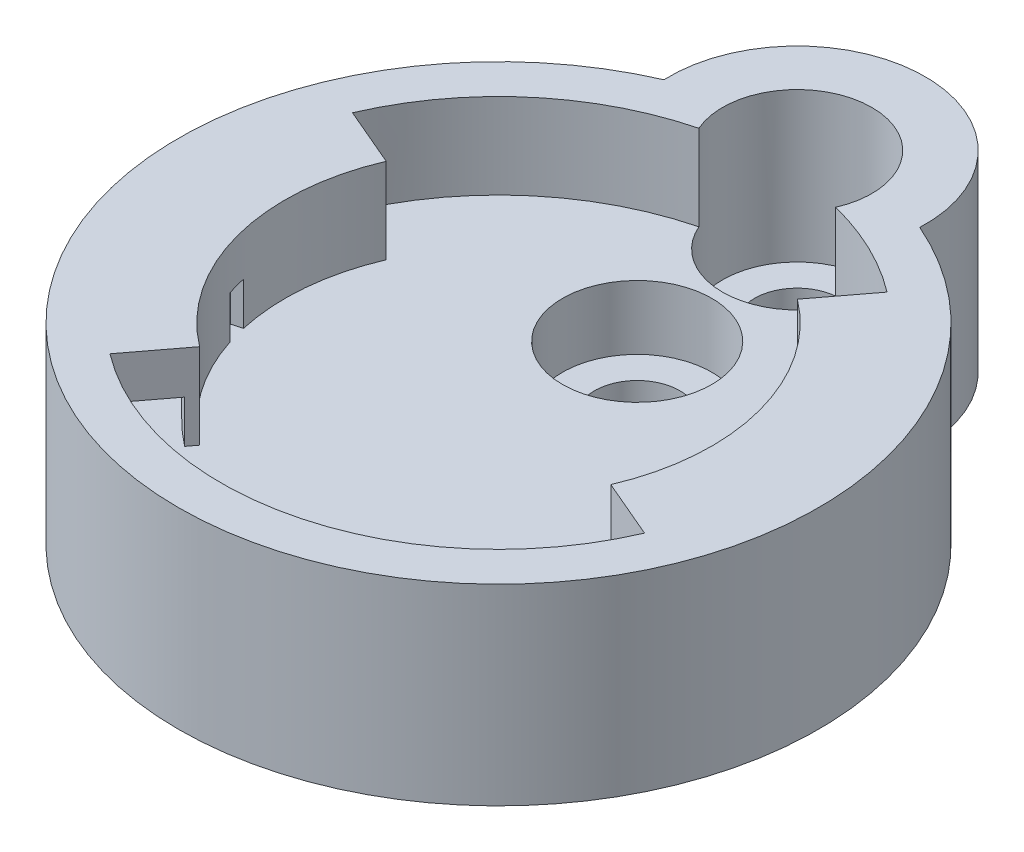
ISO-10303-21;
HEADER;
FILE_DESCRIPTION(('STEP AP214'),'2;1');
FILE_NAME('part.step','',(''),(''),'','','');
FILE_SCHEMA(('AUTOMOTIVE_DESIGN { 1 0 10303 214 1 1 1 1 }'));
ENDSEC;
DATA;
#1=APPLICATION_CONTEXT('core data for automotive mechanical design processes');
#2=APPLICATION_PROTOCOL_DEFINITION('international standard','automotive_design',2000,#1);
#3=PRODUCT_CONTEXT('',#1,'mechanical');
#4=PRODUCT('Part','Part','',(#3));
#5=PRODUCT_RELATED_PRODUCT_CATEGORY('part','',(#4));
#6=PRODUCT_DEFINITION_FORMATION('','',#4);
#7=PRODUCT_DEFINITION_CONTEXT('part definition',#1,'design');
#8=PRODUCT_DEFINITION('design','',#6,#7);
#9=PRODUCT_DEFINITION_SHAPE('','',#8);
#10=(LENGTH_UNIT() NAMED_UNIT(*) SI_UNIT(.MILLI.,.METRE.));
#11=(NAMED_UNIT(*) PLANE_ANGLE_UNIT() SI_UNIT($,.RADIAN.));
#12=(NAMED_UNIT(*) SI_UNIT($,.STERADIAN.) SOLID_ANGLE_UNIT());
#13=UNCERTAINTY_MEASURE_WITH_UNIT(LENGTH_MEASURE(1.E-05),#10,'distance_accuracy_value','');
#14=(GEOMETRIC_REPRESENTATION_CONTEXT(3) GLOBAL_UNCERTAINTY_ASSIGNED_CONTEXT((#13)) GLOBAL_UNIT_ASSIGNED_CONTEXT((#10,
#11,#12)) REPRESENTATION_CONTEXT('',''));
#15=CARTESIAN_POINT('',(0.,0.,0.));
#16=DIRECTION('',(0.,0.,1.));
#17=DIRECTION('',(1.,0.,0.));
#18=AXIS2_PLACEMENT_3D('',#15,#16,#17);
#19=CARTESIAN_POINT('',(0.,-5.,0.));
#20=DIRECTION('',(0.,1.,0.));
#21=DIRECTION('',(0.,0.,1.));
#22=AXIS2_PLACEMENT_3D('',#19,#20,#21);
#23=CYLINDRICAL_SURFACE('',#22,15.);
#24=DIRECTION('',(0.,1.,0.));
#25=VECTOR('',#24,1.);
#26=CARTESIAN_POINT('',(-5.9947894041409,-5.,-13.75));
#27=LINE('',#26,#25);
#28=CARTESIAN_POINT('',(-5.9947894041409,-5.,-13.75));
#29=VERTEX_POINT('',#28);
#30=CARTESIAN_POINT('',(-5.9947894041409,4.,-13.75));
#31=VERTEX_POINT('',#30);
#32=EDGE_CURVE('E204',#29,#31,#27,.T.);
#33=ORIENTED_EDGE('',*,*,#32,.F.);
#34=CARTESIAN_POINT('',(0.,-5.,0.));
#35=DIRECTION('',(0.,1.,0.));
#36=DIRECTION('',(0.,0.,1.));
#37=AXIS2_PLACEMENT_3D('',#34,#35,#36);
#38=CIRCLE('',#37,15.);
#39=CARTESIAN_POINT('',(5.9947894041409,-5.,-13.75));
#40=VERTEX_POINT('',#39);
#41=EDGE_CURVE('E210',#29,#40,#38,.T.);
#42=ORIENTED_EDGE('',*,*,#41,.T.);
#43=DIRECTION('',(0.,1.,0.));
#44=VECTOR('',#43,1.);
#45=CARTESIAN_POINT('',(5.9947894041409,-5.,-13.75));
#46=LINE('',#45,#44);
#47=CARTESIAN_POINT('',(5.9947894041409,4.,-13.75));
#48=VERTEX_POINT('',#47);
#49=EDGE_CURVE('E193',#40,#48,#46,.T.);
#50=ORIENTED_EDGE('',*,*,#49,.T.);
#51=CARTESIAN_POINT('',(0.,4.,0.));
#52=DIRECTION('',(0.,1.,0.));
#53=DIRECTION('',(0.,0.,1.));
#54=AXIS2_PLACEMENT_3D('',#51,#52,#53);
#55=CIRCLE('',#54,15.);
#56=EDGE_CURVE('E213',#31,#48,#55,.T.);
#57=ORIENTED_EDGE('',*,*,#56,.F.);
#58=EDGE_LOOP('',(#33,#42,#50,#57));
#59=FACE_BOUND('',#58,.T.);
#60=ADVANCED_FACE('F33',(#59),#23,.T.);
#61=CARTESIAN_POINT('',(0.,-10.,-6.5));
#62=DIRECTION('',(0.,1.,0.));
#63=DIRECTION('',(0.,0.,1.));
#64=AXIS2_PLACEMENT_3D('',#61,#62,#63);
#65=CYLINDRICAL_SURFACE('',#64,2.);
#66=CARTESIAN_POINT('',(0.,-5.,-6.5));
#67=DIRECTION('',(0.,1.,0.));
#68=DIRECTION('',(0.,0.,1.));
#69=AXIS2_PLACEMENT_3D('',#66,#67,#68);
#70=CIRCLE('',#69,2.);
#71=CARTESIAN_POINT('',(0.,-5.,-4.5));
#72=VERTEX_POINT('',#71);
#73=EDGE_CURVE('E233',#72,#72,#70,.T.);
#74=ORIENTED_EDGE('',*,*,#73,.F.);
#75=EDGE_LOOP('',(#74));
#76=FACE_BOUND('',#75,.T.);
#77=CARTESIAN_POINT('',(0.,-3.,-6.5));
#78=DIRECTION('',(0.,1.,0.));
#79=DIRECTION('',(0.,0.,1.));
#80=AXIS2_PLACEMENT_3D('',#77,#78,#79);
#81=CIRCLE('',#80,2.);
#82=CARTESIAN_POINT('',(0.,-3.,-4.5));
#83=VERTEX_POINT('',#82);
#84=EDGE_CURVE('E243',#83,#83,#81,.F.);
#85=ORIENTED_EDGE('',*,*,#84,.F.);
#86=EDGE_LOOP('',(#85));
#87=FACE_BOUND('',#86,.T.);
#88=ADVANCED_FACE('F455',(#76,#87),#65,.F.);
#89=CARTESIAN_POINT('',(0.,-10.,-14.));
#90=DIRECTION('',(0.,1.,0.));
#91=DIRECTION('',(0.,0.,1.));
#92=AXIS2_PLACEMENT_3D('',#89,#90,#91);
#93=CYLINDRICAL_SURFACE('',#92,2.);
#94=CARTESIAN_POINT('',(0.,-3.,-14.));
#95=DIRECTION('',(0.,1.,0.));
#96=DIRECTION('',(0.,0.,1.));
#97=AXIS2_PLACEMENT_3D('',#94,#95,#96);
#98=CIRCLE('',#97,2.);
#99=CARTESIAN_POINT('',(0.,-3.,-12.));
#100=VERTEX_POINT('',#99);
#101=EDGE_CURVE('E240',#100,#100,#98,.F.);
#102=ORIENTED_EDGE('',*,*,#101,.F.);
#103=EDGE_LOOP('',(#102));
#104=FACE_BOUND('',#103,.T.);
#105=CARTESIAN_POINT('',(0.,-5.,-14.));
#106=DIRECTION('',(0.,1.,0.));
#107=DIRECTION('',(0.,0.,1.));
#108=AXIS2_PLACEMENT_3D('',#105,#106,#107);
#109=CIRCLE('',#108,2.);
#110=CARTESIAN_POINT('',(0.,-5.,-12.));
#111=VERTEX_POINT('',#110);
#112=EDGE_CURVE('E232',#111,#111,#109,.T.);
#113=ORIENTED_EDGE('',*,*,#112,.F.);
#114=EDGE_LOOP('',(#113));
#115=FACE_BOUND('',#114,.T.);
#116=ADVANCED_FACE('F459',(#104,#115),#93,.F.);
#117=CARTESIAN_POINT('',(0.,0.,0.));
#118=DIRECTION('',(0.,1.,0.));
#119=DIRECTION('',(0.,0.,1.));
#120=AXIS2_PLACEMENT_3D('',#117,#118,#119);
#121=PLANE('',#120);
#122=CARTESIAN_POINT('',(0.,0.,-6.5));
#123=DIRECTION('',(0.,1.,0.));
#124=DIRECTION('',(0.,0.,1.));
#125=AXIS2_PLACEMENT_3D('',#122,#123,#124);
#126=CIRCLE('',#125,3.5);
#127=CARTESIAN_POINT('',(0.,0.,-3.));
#128=VERTEX_POINT('',#127);
#129=EDGE_CURVE('E36',#128,#128,#126,.T.);
#130=ORIENTED_EDGE('',*,*,#129,.F.);
#131=EDGE_LOOP('',(#130));
#132=FACE_BOUND('',#131,.T.);
#133=CARTESIAN_POINT('',(0.,0.,-14.));
#134=DIRECTION('',(0.,1.,0.));
#135=DIRECTION('',(0.,0.,1.));
#136=AXIS2_PLACEMENT_3D('',#133,#134,#135);
#137=CIRCLE('',#136,3.5);
#138=CARTESIAN_POINT('',(-3.20702304500989,0.,-12.5982142857143));
#139=VERTEX_POINT('',#138);
#140=CARTESIAN_POINT('',(3.20702304500989,0.,-12.5982142857143));
#141=VERTEX_POINT('',#140);
#142=EDGE_CURVE('E237',#139,#141,#137,.T.);
#143=ORIENTED_EDGE('',*,*,#142,.F.);
#144=CARTESIAN_POINT('',(0.,0.,0.));
#145=DIRECTION('',(0.,1.,0.));
#146=DIRECTION('',(0.,0.,1.));
#147=AXIS2_PLACEMENT_3D('',#144,#145,#146);
#148=CIRCLE('',#147,13.);
#149=EDGE_CURVE('E212',#141,#139,#148,.F.);
#150=ORIENTED_EDGE('',*,*,#149,.F.);
#151=EDGE_LOOP('',(#143,#150));
#152=FACE_BOUND('',#151,.T.);
#153=DIRECTION('',(-0.604207839357235,0.,0.79682676088298));
#154=VECTOR('',#153,1.);
#155=CARTESIAN_POINT('',(6.34418231325097,0.,-8.36668098927128));
#156=LINE('',#155,#154);
#157=CARTESIAN_POINT('',(6.34418231325097,0.,-8.36668098927128));
#158=VERTEX_POINT('',#157);
#159=CARTESIAN_POINT('',(6.04207839357235,0.,-7.96826760882979));
#160=VERTEX_POINT('',#159);
#161=EDGE_CURVE('E284',#158,#160,#156,.T.);
#162=ORIENTED_EDGE('',*,*,#161,.F.);
#163=CARTESIAN_POINT('',(0.,0.,0.));
#164=DIRECTION('',(0.,1.,0.));
#165=DIRECTION('',(0.,0.,-1.));
#166=AXIS2_PLACEMENT_3D('',#163,#164,#165);
#167=CIRCLE('',#166,10.5);
#168=CARTESIAN_POINT('',(9.63816863822804,0.,-4.16601791895779));
#169=VERTEX_POINT('',#168);
#170=EDGE_CURVE('E281',#169,#158,#167,.T.);
#171=ORIENTED_EDGE('',*,*,#170,.F.);
#172=DIRECTION('',(0.908445470801445,0.,-0.418003381063289));
#173=VECTOR('',#172,1.);
#174=CARTESIAN_POINT('',(9.63816863822804,0.,-4.16601791895779));
#175=LINE('',#174,#173);
#176=CARTESIAN_POINT('',(9.18381687609326,0.,-3.95695685930294));
#177=VERTEX_POINT('',#176);
#178=EDGE_CURVE('E289',#177,#169,#175,.T.);
#179=ORIENTED_EDGE('',*,*,#178,.F.);
#180=CARTESIAN_POINT('',(0.,0.,0.));
#181=DIRECTION('',(0.,-1.,0.));
#182=DIRECTION('',(0.,0.,-1.));
#183=AXIS2_PLACEMENT_3D('',#180,#181,#182);
#184=CIRCLE('',#183,10.);
#185=EDGE_CURVE('E287',#160,#177,#184,.T.);
#186=ORIENTED_EDGE('',*,*,#185,.F.);
#187=EDGE_LOOP('',(#162,#171,#179,#186));
#188=FACE_BOUND('',#187,.T.);
#189=DIRECTION('',(0.962920197873039,0.,-0.269786383140712));
#190=VECTOR('',#189,1.);
#191=CARTESIAN_POINT('',(-9.75537438532267,0.,2.19833359665689));
#192=LINE('',#191,#190);
#193=CARTESIAN_POINT('',(-10.2374438244674,0.,2.33339751025721));
#194=VERTEX_POINT('',#193);
#195=CARTESIAN_POINT('',(-9.75537438532267,0.,2.19833359665689));
#196=VERTEX_POINT('',#195);
#197=EDGE_CURVE('E326',#194,#196,#192,.T.);
#198=ORIENTED_EDGE('',*,*,#197,.F.);
#199=CARTESIAN_POINT('',(0.,0.,0.));
#200=DIRECTION('',(0.,1.,0.));
#201=DIRECTION('',(0.,0.,1.));
#202=AXIS2_PLACEMENT_3D('',#199,#200,#201);
#203=CIRCLE('',#202,10.5);
#204=CARTESIAN_POINT('',(-9.65488771857366,0.,-4.12712286487033));
#205=VERTEX_POINT('',#204);
#206=EDGE_CURVE('E323',#205,#194,#203,.T.);
#207=ORIENTED_EDGE('',*,*,#206,.F.);
#208=DIRECTION('',(-0.919513116054634,0.,-0.393059320463842));
#209=VECTOR('',#208,1.);
#210=CARTESIAN_POINT('',(-9.19513116054635,0.,-3.93059320463841));
#211=LINE('',#210,#209);
#212=CARTESIAN_POINT('',(-9.19513116054635,0.,-3.93059320463841));
#213=VERTEX_POINT('',#212);
#214=EDGE_CURVE('E332',#213,#205,#211,.T.);
#215=ORIENTED_EDGE('',*,*,#214,.F.);
#216=CARTESIAN_POINT('',(0.,0.,0.));
#217=DIRECTION('',(0.,-1.,0.));
#218=DIRECTION('',(0.,0.,1.));
#219=AXIS2_PLACEMENT_3D('',#216,#217,#218);
#220=CIRCLE('',#219,10.);
#221=EDGE_CURVE('E329',#196,#213,#220,.T.);
#222=ORIENTED_EDGE('',*,*,#221,.F.);
#223=EDGE_LOOP('',(#198,#207,#215,#222));
#224=FACE_BOUND('',#223,.T.);
#225=DIRECTION('',(0.604207839357222,0.,-0.79682676088299));
#226=VECTOR('',#225,1.);
#227=CARTESIAN_POINT('',(-6.34418231325097,0.,8.36668098927128));
#228=LINE('',#227,#226);
#229=CARTESIAN_POINT('',(-6.34418231325097,0.,8.36668098927128));
#230=VERTEX_POINT('',#229);
#231=CARTESIAN_POINT('',(-6.04207839357236,0.,7.96826760882979));
#232=VERTEX_POINT('',#231);
#233=EDGE_CURVE('E302',#230,#232,#228,.T.);
#234=ORIENTED_EDGE('',*,*,#233,.F.);
#235=CARTESIAN_POINT('',(0.,0.,0.));
#236=DIRECTION('',(0.,1.,0.));
#237=DIRECTION('',(0.,0.,-1.));
#238=AXIS2_PLACEMENT_3D('',#235,#236,#237);
#239=CIRCLE('',#238,10.5);
#240=CARTESIAN_POINT('',(-9.96953017152661,0.,3.2952189849873));
#241=VERTEX_POINT('',#240);
#242=EDGE_CURVE('E299',#241,#230,#239,.T.);
#243=ORIENTED_EDGE('',*,*,#242,.F.);
#244=DIRECTION('',(-0.908300997069552,0.,0.418317222598422));
#245=VECTOR('',#244,1.);
#246=CARTESIAN_POINT('',(-9.51235178095107,0.,3.08466588068092));
#247=LINE('',#246,#245);
#248=CARTESIAN_POINT('',(-9.51235178095107,0.,3.08466588068092));
#249=VERTEX_POINT('',#248);
#250=EDGE_CURVE('E307',#249,#241,#247,.T.);
#251=ORIENTED_EDGE('',*,*,#250,.F.);
#252=CARTESIAN_POINT('',(0.,0.,0.));
#253=DIRECTION('',(0.,-1.,0.));
#254=DIRECTION('',(0.,0.,1.));
#255=AXIS2_PLACEMENT_3D('',#252,#253,#254);
#256=CIRCLE('',#255,10.);
#257=EDGE_CURVE('E305',#232,#249,#256,.T.);
#258=ORIENTED_EDGE('',*,*,#257,.F.);
#259=EDGE_LOOP('',(#234,#243,#251,#258));
#260=FACE_BOUND('',#259,.T.);
#261=DIRECTION('',(-0.966485141792299,0.,0.256722555874466));
#262=VECTOR('',#261,1.);
#263=CARTESIAN_POINT('',(10.0788182649225,0.,-2.94404863795853));
#264=LINE('',#263,#262);
#265=CARTESIAN_POINT('',(10.0788182649225,0.,-2.94404863795853));
#266=VERTEX_POINT('',#265);
#267=CARTESIAN_POINT('',(9.59542254293686,0.,-2.81564667927265));
#268=VERTEX_POINT('',#267);
#269=EDGE_CURVE('E263',#266,#268,#264,.T.);
#270=ORIENTED_EDGE('',*,*,#269,.F.);
#271=CARTESIAN_POINT('',(0.,0.,0.));
#272=DIRECTION('',(0.,1.,0.));
#273=DIRECTION('',(0.,0.,1.));
#274=AXIS2_PLACEMENT_3D('',#271,#272,#273);
#275=CIRCLE('',#274,10.5);
#276=CARTESIAN_POINT('',(9.65488771857366,0.,4.12712286487033));
#277=VERTEX_POINT('',#276);
#278=EDGE_CURVE('E236',#277,#266,#275,.T.);
#279=ORIENTED_EDGE('',*,*,#278,.F.);
#280=DIRECTION('',(0.919513116054634,0.,0.393059320463842));
#281=VECTOR('',#280,1.);
#282=CARTESIAN_POINT('',(9.65488771857366,0.,4.12712286487033));
#283=LINE('',#282,#281);
#284=CARTESIAN_POINT('',(9.19513116054635,0.,3.93059320463841));
#285=VERTEX_POINT('',#284);
#286=EDGE_CURVE('E268',#285,#277,#283,.T.);
#287=ORIENTED_EDGE('',*,*,#286,.F.);
#288=CARTESIAN_POINT('',(0.,0.,0.));
#289=DIRECTION('',(0.,-1.,0.));
#290=DIRECTION('',(0.,0.,1.));
#291=AXIS2_PLACEMENT_3D('',#288,#289,#290);
#292=CIRCLE('',#291,10.);
#293=EDGE_CURVE('E266',#268,#285,#292,.T.);
#294=ORIENTED_EDGE('',*,*,#293,.F.);
#295=EDGE_LOOP('',(#270,#279,#287,#294));
#296=FACE_BOUND('',#295,.T.);
#297=ADVANCED_FACE('F419',(#132,#152,#188,#224,#260,#296),#121,.T.);
#298=CARTESIAN_POINT('',(0.,2.,0.));
#299=DIRECTION('',(0.,-1.,0.));
#300=DIRECTION('',(0.,0.,-1.));
#301=AXIS2_PLACEMENT_3D('',#298,#299,#300);
#302=PLANE('',#301);
#303=DIRECTION('',(0.919513116054634,0.,0.393059320463841));
#304=VECTOR('',#303,1.);
#305=CARTESIAN_POINT('',(9.19513116054635,2.,3.93059320463841));
#306=LINE('',#305,#304);
#307=CARTESIAN_POINT('',(9.65488771857366,2.,4.12712286487033));
#308=VERTEX_POINT('',#307);
#309=CARTESIAN_POINT('',(11.9536705087102,2.,5.10977116602993));
#310=VERTEX_POINT('',#309);
#311=EDGE_CURVE('E379',#308,#310,#306,.T.);
#312=ORIENTED_EDGE('',*,*,#311,.F.);
#313=CARTESIAN_POINT('',(0.,2.,0.));
#314=DIRECTION('',(0.,-1.,0.));
#315=DIRECTION('',(0.,0.,-1.));
#316=AXIS2_PLACEMENT_3D('',#313,#314,#315);
#317=CIRCLE('',#316,10.5);
#318=CARTESIAN_POINT('',(10.0788182649225,2.,-2.94404863795853));
#319=VERTEX_POINT('',#318);
#320=EDGE_CURVE('E278',#308,#319,#317,.F.);
#321=ORIENTED_EDGE('',*,*,#320,.T.);
#322=DIRECTION('',(-0.9664851417923,0.,0.256722555874466));
#323=VECTOR('',#322,1.);
#324=CARTESIAN_POINT('',(-0.0662136968057209,2.,-0.24927515203285));
#325=LINE('',#324,#323);
#326=CARTESIAN_POINT('',(9.59542254293686,2.,-2.81564667927265));
#327=VERTEX_POINT('',#326);
#328=EDGE_CURVE('E275',#319,#327,#325,.T.);
#329=ORIENTED_EDGE('',*,*,#328,.T.);
#330=CARTESIAN_POINT('',(0.,2.,0.));
#331=DIRECTION('',(0.,-1.,0.));
#332=DIRECTION('',(0.,0.,-1.));
#333=AXIS2_PLACEMENT_3D('',#330,#331,#332);
#334=CIRCLE('',#333,10.);
#335=CARTESIAN_POINT('',(9.18381687609326,2.,-3.95695685930294));
#336=VERTEX_POINT('',#335);
#337=EDGE_CURVE('E376',#336,#327,#334,.T.);
#338=ORIENTED_EDGE('',*,*,#337,.F.);
#339=DIRECTION('',(0.908445470801445,0.,-0.418003381063289));
#340=VECTOR('',#339,1.);
#341=CARTESIAN_POINT('',(0.102070978353727,2.,0.221830545365077));
#342=LINE('',#341,#340);
#343=CARTESIAN_POINT('',(9.63816863822804,2.,-4.16601791895779));
#344=VERTEX_POINT('',#343);
#345=EDGE_CURVE('E226',#336,#344,#342,.T.);
#346=ORIENTED_EDGE('',*,*,#345,.T.);
#347=CARTESIAN_POINT('',(0.,2.,0.));
#348=DIRECTION('',(0.,-1.,0.));
#349=DIRECTION('',(0.,0.,-1.));
#350=AXIS2_PLACEMENT_3D('',#347,#348,#349);
#351=CIRCLE('',#350,10.5);
#352=CARTESIAN_POINT('',(6.34418231325097,2.,-8.36668098927128));
#353=VERTEX_POINT('',#352);
#354=EDGE_CURVE('E229',#344,#353,#351,.F.);
#355=ORIENTED_EDGE('',*,*,#354,.T.);
#356=DIRECTION('',(-0.604207839357236,0.,0.796826760882979));
#357=VECTOR('',#356,1.);
#358=CARTESIAN_POINT('',(6.04207839357236,2.,-7.9682676088298));
#359=LINE('',#358,#357);
#360=CARTESIAN_POINT('',(7.85470191164406,2.,-10.3587478914787));
#361=VERTEX_POINT('',#360);
#362=EDGE_CURVE('E372',#361,#353,#359,.T.);
#363=ORIENTED_EDGE('',*,*,#362,.F.);
#364=CARTESIAN_POINT('',(0.,2.,0.));
#365=DIRECTION('',(0.,1.,0.));
#366=DIRECTION('',(0.,0.,-1.));
#367=AXIS2_PLACEMENT_3D('',#364,#365,#366);
#368=CIRCLE('',#367,13.);
#369=EDGE_CURVE('E370',#310,#361,#368,.T.);
#370=ORIENTED_EDGE('',*,*,#369,.F.);
#371=EDGE_LOOP('',(#312,#321,#329,#338,#346,#355,#363,#370));
#372=FACE_BOUND('',#371,.T.);
#373=ADVANCED_FACE('F424',(#372),#302,.T.);
#374=CARTESIAN_POINT('',(0.,2.,0.));
#375=DIRECTION('',(0.,1.,0.));
#376=DIRECTION('',(0.,0.,1.));
#377=AXIS2_PLACEMENT_3D('',#374,#375,#376);
#378=PLANE('',#377);
#379=CARTESIAN_POINT('',(0.,2.,0.));
#380=DIRECTION('',(0.,1.,0.));
#381=DIRECTION('',(0.,0.,1.));
#382=AXIS2_PLACEMENT_3D('',#379,#380,#381);
#383=CIRCLE('',#382,10.5);
#384=CARTESIAN_POINT('',(-6.34418231325097,2.,8.36668098927129));
#385=VERTEX_POINT('',#384);
#386=CARTESIAN_POINT('',(-9.96953017152661,2.,3.2952189849873));
#387=VERTEX_POINT('',#386);
#388=EDGE_CURVE('E317',#385,#387,#383,.F.);
#389=ORIENTED_EDGE('',*,*,#388,.F.);
#390=DIRECTION('',(0.604207839357236,0.,-0.796826760882979));
#391=VECTOR('',#390,1.);
#392=CARTESIAN_POINT('',(-6.04207839357236,2.,7.9682676088298));
#393=LINE('',#392,#391);
#394=CARTESIAN_POINT('',(-7.85470191164406,2.,10.3587478914787));
#395=VERTEX_POINT('',#394);
#396=EDGE_CURVE('E344',#395,#385,#393,.T.);
#397=ORIENTED_EDGE('',*,*,#396,.F.);
#398=CARTESIAN_POINT('',(0.,2.,0.));
#399=DIRECTION('',(0.,1.,0.));
#400=DIRECTION('',(0.,0.,1.));
#401=AXIS2_PLACEMENT_3D('',#398,#399,#400);
#402=CIRCLE('',#401,13.);
#403=CARTESIAN_POINT('',(-11.9536705087102,2.,-5.10977116602993));
#404=VERTEX_POINT('',#403);
#405=EDGE_CURVE('E342',#404,#395,#402,.T.);
#406=ORIENTED_EDGE('',*,*,#405,.F.);
#407=DIRECTION('',(-0.919513116054634,0.,-0.393059320463841));
#408=VECTOR('',#407,1.);
#409=CARTESIAN_POINT('',(-9.19513116054635,2.,-3.93059320463841));
#410=LINE('',#409,#408);
#411=CARTESIAN_POINT('',(-9.65488771857366,2.,-4.12712286487033));
#412=VERTEX_POINT('',#411);
#413=EDGE_CURVE('E350',#412,#404,#410,.T.);
#414=ORIENTED_EDGE('',*,*,#413,.F.);
#415=CARTESIAN_POINT('',(0.,2.,0.));
#416=DIRECTION('',(0.,1.,0.));
#417=DIRECTION('',(0.,0.,1.));
#418=AXIS2_PLACEMENT_3D('',#415,#416,#417);
#419=CIRCLE('',#418,10.5);
#420=CARTESIAN_POINT('',(-10.2374438244674,2.,2.33339751025721));
#421=VERTEX_POINT('',#420);
#422=EDGE_CURVE('E223',#421,#412,#419,.F.);
#423=ORIENTED_EDGE('',*,*,#422,.F.);
#424=DIRECTION('',(-0.962920197873039,0.,0.269786383140712));
#425=VECTOR('',#424,1.);
#426=CARTESIAN_POINT('',(-0.138952761626076,2.,-0.495949495902467));
#427=LINE('',#426,#425);
#428=CARTESIAN_POINT('',(-9.75537438532267,2.,2.19833359665689));
#429=VERTEX_POINT('',#428);
#430=EDGE_CURVE('E216',#429,#421,#427,.T.);
#431=ORIENTED_EDGE('',*,*,#430,.F.);
#432=CARTESIAN_POINT('',(0.,2.,0.));
#433=DIRECTION('',(0.,-1.,0.));
#434=DIRECTION('',(0.,0.,1.));
#435=AXIS2_PLACEMENT_3D('',#432,#433,#434);
#436=CIRCLE('',#435,10.);
#437=CARTESIAN_POINT('',(-9.51235178095107,2.,3.08466588068091));
#438=VERTEX_POINT('',#437);
#439=EDGE_CURVE('E348',#438,#429,#436,.T.);
#440=ORIENTED_EDGE('',*,*,#439,.F.);
#441=DIRECTION('',(0.908300997069552,0.,-0.418317222598422));
#442=VECTOR('',#441,1.);
#443=CARTESIAN_POINT('',(-0.492516441726985,2.,-1.06941132453258));
#444=LINE('',#443,#442);
#445=EDGE_CURVE('E320',#387,#438,#444,.T.);
#446=ORIENTED_EDGE('',*,*,#445,.F.);
#447=EDGE_LOOP('',(#389,#397,#406,#414,#423,#431,#440,#446));
#448=FACE_BOUND('',#447,.T.);
#449=ADVANCED_FACE('F512',(#448),#378,.F.);
#450=CARTESIAN_POINT('',(0.,-5.,0.));
#451=DIRECTION('',(0.,1.,0.));
#452=DIRECTION('',(0.,0.,1.));
#453=AXIS2_PLACEMENT_3D('',#450,#451,#452);
#454=PLANE('',#453);
#455=ORIENTED_EDGE('',*,*,#112,.T.);
#456=EDGE_LOOP('',(#455));
#457=FACE_BOUND('',#456,.T.);
#458=ORIENTED_EDGE('',*,*,#41,.F.);
#459=CARTESIAN_POINT('',(0.,-5.,-14.));
#460=DIRECTION('',(0.,1.,0.));
#461=DIRECTION('',(0.,0.,-1.));
#462=AXIS2_PLACEMENT_3D('',#459,#460,#461);
#463=CIRCLE('',#462,6.);
#464=EDGE_CURVE('E196',#40,#29,#463,.T.);
#465=ORIENTED_EDGE('',*,*,#464,.F.);
#466=EDGE_LOOP('',(#458,#465));
#467=FACE_BOUND('',#466,.T.);
#468=ORIENTED_EDGE('',*,*,#73,.T.);
#469=EDGE_LOOP('',(#468));
#470=FACE_BOUND('',#469,.T.);
#471=ADVANCED_FACE('F208',(#457,#467,#470),#454,.F.);
#472=CARTESIAN_POINT('',(0.,4.,0.));
#473=DIRECTION('',(0.,1.,0.));
#474=DIRECTION('',(0.,0.,1.));
#475=AXIS2_PLACEMENT_3D('',#472,#473,#474);
#476=PLANE('',#475);
#477=CARTESIAN_POINT('',(0.,4.,-14.));
#478=DIRECTION('',(0.,1.,0.));
#479=DIRECTION('',(0.,0.,1.));
#480=AXIS2_PLACEMENT_3D('',#477,#478,#479);
#481=CIRCLE('',#480,6.);
#482=EDGE_CURVE('E199',#48,#31,#481,.T.);
#483=ORIENTED_EDGE('',*,*,#482,.T.);
#484=ORIENTED_EDGE('',*,*,#56,.T.);
#485=EDGE_LOOP('',(#483,#484));
#486=FACE_BOUND('',#485,.T.);
#487=CARTESIAN_POINT('',(0.,4.,-14.));
#488=DIRECTION('',(0.,1.,0.));
#489=DIRECTION('',(0.,0.,1.));
#490=AXIS2_PLACEMENT_3D('',#487,#488,#489);
#491=CIRCLE('',#490,3.5);
#492=CARTESIAN_POINT('',(3.20702304500989,4.,-12.5982142857143));
#493=VERTEX_POINT('',#492);
#494=CARTESIAN_POINT('',(-3.20702304500989,4.,-12.5982142857143));
#495=VERTEX_POINT('',#494);
#496=EDGE_CURVE('E249',#493,#495,#491,.T.);
#497=ORIENTED_EDGE('',*,*,#496,.F.);
#498=CARTESIAN_POINT('',(0.,4.,0.));
#499=DIRECTION('',(0.,1.,0.));
#500=DIRECTION('',(0.,0.,1.));
#501=AXIS2_PLACEMENT_3D('',#498,#499,#500);
#502=CIRCLE('',#501,13.);
#503=CARTESIAN_POINT('',(7.85470191164406,4.,-10.3587478914787));
#504=VERTEX_POINT('',#503);
#505=EDGE_CURVE('E218',#504,#493,#502,.T.);
#506=ORIENTED_EDGE('',*,*,#505,.F.);
#507=DIRECTION('',(-0.604207839357236,0.,0.796826760882979));
#508=VECTOR('',#507,1.);
#509=CARTESIAN_POINT('',(6.04207839357236,4.,-7.9682676088298));
#510=LINE('',#509,#508);
#511=CARTESIAN_POINT('',(6.04207839357236,4.,-7.9682676088298));
#512=VERTEX_POINT('',#511);
#513=EDGE_CURVE('E363',#504,#512,#510,.T.);
#514=ORIENTED_EDGE('',*,*,#513,.T.);
#515=CARTESIAN_POINT('',(0.,4.,0.));
#516=DIRECTION('',(0.,-1.,0.));
#517=DIRECTION('',(0.,0.,-1.));
#518=AXIS2_PLACEMENT_3D('',#515,#516,#517);
#519=CIRCLE('',#518,10.);
#520=CARTESIAN_POINT('',(9.19513116054635,4.,3.93059320463841));
#521=VERTEX_POINT('',#520);
#522=EDGE_CURVE('E384',#512,#521,#519,.T.);
#523=ORIENTED_EDGE('',*,*,#522,.T.);
#524=DIRECTION('',(0.919513116054634,0.,0.393059320463841));
#525=VECTOR('',#524,1.);
#526=CARTESIAN_POINT('',(9.19513116054635,4.,3.93059320463841));
#527=LINE('',#526,#525);
#528=CARTESIAN_POINT('',(11.9536705087102,4.,5.10977116602993));
#529=VERTEX_POINT('',#528);
#530=EDGE_CURVE('E373',#521,#529,#527,.T.);
#531=ORIENTED_EDGE('',*,*,#530,.T.);
#532=CARTESIAN_POINT('',(-7.85470191164406,4.,10.3587478914787));
#533=VERTEX_POINT('',#532);
#534=EDGE_CURVE('E392',#533,#529,#502,.T.);
#535=ORIENTED_EDGE('',*,*,#534,.F.);
#536=DIRECTION('',(0.604207839357236,0.,-0.796826760882979));
#537=VECTOR('',#536,1.);
#538=CARTESIAN_POINT('',(-6.04207839357236,4.,7.9682676088298));
#539=LINE('',#538,#537);
#540=CARTESIAN_POINT('',(-6.04207839357236,4.,7.96826760882979));
#541=VERTEX_POINT('',#540);
#542=EDGE_CURVE('E341',#533,#541,#539,.T.);
#543=ORIENTED_EDGE('',*,*,#542,.T.);
#544=CARTESIAN_POINT('',(0.,4.,0.));
#545=DIRECTION('',(0.,-1.,0.));
#546=DIRECTION('',(0.,0.,1.));
#547=AXIS2_PLACEMENT_3D('',#544,#545,#546);
#548=CIRCLE('',#547,10.);
#549=CARTESIAN_POINT('',(-9.19513116054635,4.,-3.93059320463841));
#550=VERTEX_POINT('',#549);
#551=EDGE_CURVE('E355',#541,#550,#548,.T.);
#552=ORIENTED_EDGE('',*,*,#551,.T.);
#553=DIRECTION('',(-0.919513116054634,0.,-0.393059320463841));
#554=VECTOR('',#553,1.);
#555=CARTESIAN_POINT('',(-9.19513116054635,4.,-3.93059320463841));
#556=LINE('',#555,#554);
#557=CARTESIAN_POINT('',(-11.9536705087102,4.,-5.10977116602993));
#558=VERTEX_POINT('',#557);
#559=EDGE_CURVE('E345',#550,#558,#556,.T.);
#560=ORIENTED_EDGE('',*,*,#559,.T.);
#561=EDGE_CURVE('E398',#495,#558,#502,.T.);
#562=ORIENTED_EDGE('',*,*,#561,.F.);
#563=EDGE_LOOP('',(#497,#506,#514,#523,#531,#535,#543,#552,#560,#562));
#564=FACE_BOUND('',#563,.T.);
#565=ADVANCED_FACE('F409',(#486,#564),#476,.T.);
#566=CARTESIAN_POINT('',(0.,4.,0.));
#567=DIRECTION('',(0.,-1.,0.));
#568=DIRECTION('',(0.,0.,-1.));
#569=AXIS2_PLACEMENT_3D('',#566,#567,#568);
#570=CYLINDRICAL_SURFACE('',#569,13.);
#571=DIRECTION('',(0.,1.,0.));
#572=VECTOR('',#571,1.);
#573=CARTESIAN_POINT('',(3.20702304500989,0.5,-12.5982142857143));
#574=LINE('',#573,#572);
#575=EDGE_CURVE('E11',#141,#493,#574,.T.);
#576=ORIENTED_EDGE('',*,*,#575,.F.);
#577=ORIENTED_EDGE('',*,*,#149,.T.);
#578=DIRECTION('',(0.,1.,0.));
#579=VECTOR('',#578,1.);
#580=CARTESIAN_POINT('',(-3.20702304500989,0.5,-12.5982142857143));
#581=LINE('',#580,#579);
#582=EDGE_CURVE('E41',#495,#139,#581,.F.);
#583=ORIENTED_EDGE('',*,*,#582,.F.);
#584=ORIENTED_EDGE('',*,*,#561,.T.);
#585=DIRECTION('',(0.,1.,0.));
#586=VECTOR('',#585,1.);
#587=CARTESIAN_POINT('',(-11.9536705087102,2.,-5.10977116602993));
#588=LINE('',#587,#586);
#589=EDGE_CURVE('E360',#404,#558,#588,.T.);
#590=ORIENTED_EDGE('',*,*,#589,.F.);
#591=ORIENTED_EDGE('',*,*,#405,.T.);
#592=DIRECTION('',(0.,1.,0.));
#593=VECTOR('',#592,1.);
#594=CARTESIAN_POINT('',(-7.85470191164406,2.,10.3587478914787));
#595=LINE('',#594,#593);
#596=EDGE_CURVE('E352',#395,#533,#595,.T.);
#597=ORIENTED_EDGE('',*,*,#596,.T.);
#598=ORIENTED_EDGE('',*,*,#534,.T.);
#599=DIRECTION('',(0.,1.,0.));
#600=VECTOR('',#599,1.);
#601=CARTESIAN_POINT('',(11.9536705087102,2.,5.10977116602993));
#602=LINE('',#601,#600);
#603=EDGE_CURVE('E389',#310,#529,#602,.T.);
#604=ORIENTED_EDGE('',*,*,#603,.F.);
#605=ORIENTED_EDGE('',*,*,#369,.T.);
#606=DIRECTION('',(0.,1.,0.));
#607=VECTOR('',#606,1.);
#608=CARTESIAN_POINT('',(7.85470191164406,2.,-10.3587478914787));
#609=LINE('',#608,#607);
#610=EDGE_CURVE('E381',#361,#504,#609,.T.);
#611=ORIENTED_EDGE('',*,*,#610,.T.);
#612=ORIENTED_EDGE('',*,*,#505,.T.);
#613=EDGE_LOOP('',(#576,#577,#583,#584,#590,#591,#597,#598,#604,#605,#611,#612));
#614=FACE_BOUND('',#613,.T.);
#615=ADVANCED_FACE('F402',(#614),#570,.F.);
#616=CARTESIAN_POINT('',(9.19513116054635,2.,3.93059320463841));
#617=DIRECTION('',(-0.393059320463841,0.,0.919513116054634));
#618=DIRECTION('',(0.919513116054634,0.,0.393059320463841));
#619=AXIS2_PLACEMENT_3D('',#616,#617,#618);
#620=PLANE('',#619);
#621=DIRECTION('',(0.,1.,0.));
#622=VECTOR('',#621,1.);
#623=CARTESIAN_POINT('',(9.19513116054635,2.,3.93059320463841));
#624=LINE('',#623,#622);
#625=EDGE_CURVE('E49',#285,#521,#624,.T.);
#626=ORIENTED_EDGE('',*,*,#625,.F.);
#627=ORIENTED_EDGE('',*,*,#286,.T.);
#628=DIRECTION('',(0.,-1.,0.));
#629=VECTOR('',#628,1.);
#630=CARTESIAN_POINT('',(9.65488771857366,3.,4.12712286487033));
#631=LINE('',#630,#629);
#632=EDGE_CURVE('E55',#308,#277,#631,.T.);
#633=ORIENTED_EDGE('',*,*,#632,.F.);
#634=ORIENTED_EDGE('',*,*,#311,.T.);
#635=ORIENTED_EDGE('',*,*,#603,.T.);
#636=ORIENTED_EDGE('',*,*,#530,.F.);
#637=EDGE_LOOP('',(#626,#627,#633,#634,#635,#636));
#638=FACE_BOUND('',#637,.T.);
#639=ADVANCED_FACE('F407',(#638),#620,.T.);
#640=CARTESIAN_POINT('',(0.,2.,0.));
#641=DIRECTION('',(0.,1.,0.));
#642=DIRECTION('',(0.,0.,1.));
#643=AXIS2_PLACEMENT_3D('',#640,#641,#642);
#644=CYLINDRICAL_SURFACE('',#643,10.);
#645=ORIENTED_EDGE('',*,*,#337,.T.);
#646=DIRECTION('',(0.,-1.,0.));
#647=VECTOR('',#646,1.);
#648=CARTESIAN_POINT('',(9.59542254293686,3.,-2.81564667927265));
#649=LINE('',#648,#647);
#650=EDGE_CURVE('E271',#327,#268,#649,.T.);
#651=ORIENTED_EDGE('',*,*,#650,.T.);
#652=ORIENTED_EDGE('',*,*,#293,.T.);
#653=ORIENTED_EDGE('',*,*,#625,.T.);
#654=ORIENTED_EDGE('',*,*,#522,.F.);
#655=DIRECTION('',(0.,1.,0.));
#656=VECTOR('',#655,1.);
#657=CARTESIAN_POINT('',(6.04207839357236,2.,-7.9682676088298));
#658=LINE('',#657,#656);
#659=EDGE_CURVE('E394',#160,#512,#658,.T.);
#660=ORIENTED_EDGE('',*,*,#659,.F.);
#661=ORIENTED_EDGE('',*,*,#185,.T.);
#662=DIRECTION('',(0.,-1.,0.));
#663=VECTOR('',#662,1.);
#664=CARTESIAN_POINT('',(9.18381687609326,3.,-3.95695685930294));
#665=LINE('',#664,#663);
#666=EDGE_CURVE('E294',#336,#177,#665,.T.);
#667=ORIENTED_EDGE('',*,*,#666,.F.);
#668=EDGE_LOOP('',(#645,#651,#652,#653,#654,#660,#661,#667));
#669=FACE_BOUND('',#668,.T.);
#670=ADVANCED_FACE('F413',(#669),#644,.F.);
#671=CARTESIAN_POINT('',(6.04207839357236,2.,-7.9682676088298));
#672=DIRECTION('',(-0.796826760882979,0.,-0.604207839357236));
#673=DIRECTION('',(-0.604207839357236,0.,0.796826760882979));
#674=AXIS2_PLACEMENT_3D('',#671,#672,#673);
#675=PLANE('',#674);
#676=ORIENTED_EDGE('',*,*,#362,.T.);
#677=DIRECTION('',(0.,-1.,0.));
#678=VECTOR('',#677,1.);
#679=CARTESIAN_POINT('',(6.34418231325097,3.,-8.36668098927128));
#680=LINE('',#679,#678);
#681=EDGE_CURVE('E297',#353,#158,#680,.T.);
#682=ORIENTED_EDGE('',*,*,#681,.T.);
#683=ORIENTED_EDGE('',*,*,#161,.T.);
#684=ORIENTED_EDGE('',*,*,#659,.T.);
#685=ORIENTED_EDGE('',*,*,#513,.F.);
#686=ORIENTED_EDGE('',*,*,#610,.F.);
#687=EDGE_LOOP('',(#676,#682,#683,#684,#685,#686));
#688=FACE_BOUND('',#687,.T.);
#689=ADVANCED_FACE('F428',(#688),#675,.T.);
#690=CARTESIAN_POINT('',(-9.19513116054635,2.,-3.93059320463841));
#691=DIRECTION('',(0.393059320463841,0.,-0.919513116054634));
#692=DIRECTION('',(-0.919513116054634,0.,-0.393059320463841));
#693=AXIS2_PLACEMENT_3D('',#690,#691,#692);
#694=PLANE('',#693);
#695=DIRECTION('',(0.,-1.,0.));
#696=VECTOR('',#695,1.);
#697=CARTESIAN_POINT('',(-9.65488771857366,3.,-4.12712286487033));
#698=LINE('',#697,#696);
#699=EDGE_CURVE('E335',#412,#205,#698,.T.);
#700=ORIENTED_EDGE('',*,*,#699,.F.);
#701=ORIENTED_EDGE('',*,*,#413,.T.);
#702=ORIENTED_EDGE('',*,*,#589,.T.);
#703=ORIENTED_EDGE('',*,*,#559,.F.);
#704=DIRECTION('',(0.,1.,0.));
#705=VECTOR('',#704,1.);
#706=CARTESIAN_POINT('',(-9.19513116054635,2.,-3.93059320463841));
#707=LINE('',#706,#705);
#708=EDGE_CURVE('E364',#213,#550,#707,.T.);
#709=ORIENTED_EDGE('',*,*,#708,.F.);
#710=ORIENTED_EDGE('',*,*,#214,.T.);
#711=EDGE_LOOP('',(#700,#701,#702,#703,#709,#710));
#712=FACE_BOUND('',#711,.T.);
#713=ADVANCED_FACE('F572',(#712),#694,.T.);
#714=CARTESIAN_POINT('',(0.,2.,0.));
#715=DIRECTION('',(0.,1.,0.));
#716=DIRECTION('',(0.,0.,1.));
#717=AXIS2_PLACEMENT_3D('',#714,#715,#716);
#718=CYLINDRICAL_SURFACE('',#717,10.);
#719=DIRECTION('',(0.,1.,0.));
#720=VECTOR('',#719,1.);
#721=CARTESIAN_POINT('',(-6.04207839357236,2.,7.96826760882979));
#722=LINE('',#721,#720);
#723=EDGE_CURVE('E366',#232,#541,#722,.T.);
#724=ORIENTED_EDGE('',*,*,#723,.F.);
#725=ORIENTED_EDGE('',*,*,#257,.T.);
#726=DIRECTION('',(0.,-1.,0.));
#727=VECTOR('',#726,1.);
#728=CARTESIAN_POINT('',(-9.51235178095107,3.,3.08466588068091));
#729=LINE('',#728,#727);
#730=EDGE_CURVE('E312',#438,#249,#729,.T.);
#731=ORIENTED_EDGE('',*,*,#730,.F.);
#732=ORIENTED_EDGE('',*,*,#439,.T.);
#733=DIRECTION('',(0.,-1.,0.));
#734=VECTOR('',#733,1.);
#735=CARTESIAN_POINT('',(-9.75537438532267,3.,2.19833359665689));
#736=LINE('',#735,#734);
#737=EDGE_CURVE('E337',#429,#196,#736,.T.);
#738=ORIENTED_EDGE('',*,*,#737,.T.);
#739=ORIENTED_EDGE('',*,*,#221,.T.);
#740=ORIENTED_EDGE('',*,*,#708,.T.);
#741=ORIENTED_EDGE('',*,*,#551,.F.);
#742=EDGE_LOOP('',(#724,#725,#731,#732,#738,#739,#740,#741));
#743=FACE_BOUND('',#742,.T.);
#744=ADVANCED_FACE('F582',(#743),#718,.F.);
#745=CARTESIAN_POINT('',(-6.04207839357236,2.,7.9682676088298));
#746=DIRECTION('',(0.796826760882979,0.,0.604207839357236));
#747=DIRECTION('',(0.604207839357236,0.,-0.796826760882979));
#748=AXIS2_PLACEMENT_3D('',#745,#746,#747);
#749=PLANE('',#748);
#750=ORIENTED_EDGE('',*,*,#396,.T.);
#751=DIRECTION('',(0.,-1.,0.));
#752=VECTOR('',#751,1.);
#753=CARTESIAN_POINT('',(-6.34418231325097,3.,8.36668098927128));
#754=LINE('',#753,#752);
#755=EDGE_CURVE('E315',#385,#230,#754,.T.);
#756=ORIENTED_EDGE('',*,*,#755,.T.);
#757=ORIENTED_EDGE('',*,*,#233,.T.);
#758=ORIENTED_EDGE('',*,*,#723,.T.);
#759=ORIENTED_EDGE('',*,*,#542,.F.);
#760=ORIENTED_EDGE('',*,*,#596,.F.);
#761=EDGE_LOOP('',(#750,#756,#757,#758,#759,#760));
#762=FACE_BOUND('',#761,.T.);
#763=ADVANCED_FACE('F594',(#762),#749,.T.);
#764=CARTESIAN_POINT('',(0.,3.,0.));
#765=DIRECTION('',(0.,-1.,0.));
#766=DIRECTION('',(0.,0.,-1.));
#767=AXIS2_PLACEMENT_3D('',#764,#765,#766);
#768=CYLINDRICAL_SURFACE('',#767,10.5);
#769=DIRECTION('',(0.,-1.,0.));
#770=VECTOR('',#769,1.);
#771=CARTESIAN_POINT('',(-10.2374438244674,3.,2.33339751025721));
#772=LINE('',#771,#770);
#773=EDGE_CURVE('E339',#421,#194,#772,.T.);
#774=ORIENTED_EDGE('',*,*,#773,.F.);
#775=ORIENTED_EDGE('',*,*,#422,.T.);
#776=ORIENTED_EDGE('',*,*,#699,.T.);
#777=ORIENTED_EDGE('',*,*,#206,.T.);
#778=EDGE_LOOP('',(#774,#775,#776,#777));
#779=FACE_BOUND('',#778,.T.);
#780=ADVANCED_FACE('F604',(#779),#768,.T.);
#781=CARTESIAN_POINT('',(-9.75537438532267,3.,2.19833359665689));
#782=DIRECTION('',(-0.269786383140712,0.,-0.962920197873039));
#783=DIRECTION('',(-0.962920197873039,0.,0.269786383140712));
#784=AXIS2_PLACEMENT_3D('',#781,#782,#783);
#785=PLANE('',#784);
#786=ORIENTED_EDGE('',*,*,#737,.F.);
#787=ORIENTED_EDGE('',*,*,#430,.T.);
#788=ORIENTED_EDGE('',*,*,#773,.T.);
#789=ORIENTED_EDGE('',*,*,#197,.T.);
#790=EDGE_LOOP('',(#786,#787,#788,#789));
#791=FACE_BOUND('',#790,.T.);
#792=ADVANCED_FACE('F614',(#791),#785,.F.);
#793=CARTESIAN_POINT('',(-9.51235178095107,3.,3.08466588068092));
#794=DIRECTION('',(0.418317222598422,0.,0.908300997069552));
#795=DIRECTION('',(0.908300997069552,0.,-0.418317222598422));
#796=AXIS2_PLACEMENT_3D('',#793,#794,#795);
#797=PLANE('',#796);
#798=DIRECTION('',(0.,-1.,0.));
#799=VECTOR('',#798,1.);
#800=CARTESIAN_POINT('',(-9.96953017152661,3.,3.2952189849873));
#801=LINE('',#800,#799);
#802=EDGE_CURVE('E310',#387,#241,#801,.T.);
#803=ORIENTED_EDGE('',*,*,#802,.F.);
#804=ORIENTED_EDGE('',*,*,#445,.T.);
#805=ORIENTED_EDGE('',*,*,#730,.T.);
#806=ORIENTED_EDGE('',*,*,#250,.T.);
#807=EDGE_LOOP('',(#803,#804,#805,#806));
#808=FACE_BOUND('',#807,.T.);
#809=ADVANCED_FACE('F624',(#808),#797,.F.);
#810=CARTESIAN_POINT('',(0.,3.,0.));
#811=DIRECTION('',(0.,-1.,0.));
#812=DIRECTION('',(0.,0.,-1.));
#813=AXIS2_PLACEMENT_3D('',#810,#811,#812);
#814=CYLINDRICAL_SURFACE('',#813,10.5);
#815=ORIENTED_EDGE('',*,*,#755,.F.);
#816=ORIENTED_EDGE('',*,*,#388,.T.);
#817=ORIENTED_EDGE('',*,*,#802,.T.);
#818=ORIENTED_EDGE('',*,*,#242,.T.);
#819=EDGE_LOOP('',(#815,#816,#817,#818));
#820=FACE_BOUND('',#819,.T.);
#821=ADVANCED_FACE('F634',(#820),#814,.T.);
#822=CARTESIAN_POINT('',(0.,3.,0.));
#823=DIRECTION('',(0.,-1.,0.));
#824=DIRECTION('',(0.,0.,-1.));
#825=AXIS2_PLACEMENT_3D('',#822,#823,#824);
#826=CYLINDRICAL_SURFACE('',#825,10.5);
#827=ORIENTED_EDGE('',*,*,#354,.F.);
#828=DIRECTION('',(0.,-1.,0.));
#829=VECTOR('',#828,1.);
#830=CARTESIAN_POINT('',(9.63816863822804,3.,-4.16601791895779));
#831=LINE('',#830,#829);
#832=EDGE_CURVE('E292',#344,#169,#831,.T.);
#833=ORIENTED_EDGE('',*,*,#832,.T.);
#834=ORIENTED_EDGE('',*,*,#170,.T.);
#835=ORIENTED_EDGE('',*,*,#681,.F.);
#836=EDGE_LOOP('',(#827,#833,#834,#835));
#837=FACE_BOUND('',#836,.T.);
#838=ADVANCED_FACE('F644',(#837),#826,.T.);
#839=CARTESIAN_POINT('',(9.63816863822804,3.,-4.16601791895779));
#840=DIRECTION('',(-0.418003381063289,0.,-0.908445470801445));
#841=DIRECTION('',(-0.908445470801445,0.,0.418003381063289));
#842=AXIS2_PLACEMENT_3D('',#839,#840,#841);
#843=PLANE('',#842);
#844=ORIENTED_EDGE('',*,*,#345,.F.);
#845=ORIENTED_EDGE('',*,*,#666,.T.);
#846=ORIENTED_EDGE('',*,*,#178,.T.);
#847=ORIENTED_EDGE('',*,*,#832,.F.);
#848=EDGE_LOOP('',(#844,#845,#846,#847));
#849=FACE_BOUND('',#848,.T.);
#850=ADVANCED_FACE('F438',(#849),#843,.F.);
#851=CARTESIAN_POINT('',(0.,3.,0.));
#852=DIRECTION('',(0.,-1.,0.));
#853=DIRECTION('',(0.,0.,-1.));
#854=AXIS2_PLACEMENT_3D('',#851,#852,#853);
#855=CYLINDRICAL_SURFACE('',#854,10.5);
#856=ORIENTED_EDGE('',*,*,#320,.F.);
#857=ORIENTED_EDGE('',*,*,#632,.T.);
#858=ORIENTED_EDGE('',*,*,#278,.T.);
#859=DIRECTION('',(0.,-1.,0.));
#860=VECTOR('',#859,1.);
#861=CARTESIAN_POINT('',(10.0788182649225,3.,-2.94404863795853));
#862=LINE('',#861,#860);
#863=EDGE_CURVE('E273',#319,#266,#862,.T.);
#864=ORIENTED_EDGE('',*,*,#863,.F.);
#865=EDGE_LOOP('',(#856,#857,#858,#864));
#866=FACE_BOUND('',#865,.T.);
#867=ADVANCED_FACE('F422',(#866),#855,.T.);
#868=CARTESIAN_POINT('',(10.0788182649225,3.,-2.94404863795853));
#869=DIRECTION('',(0.256722555874466,0.,0.9664851417923));
#870=DIRECTION('',(0.9664851417923,0.,-0.256722555874466));
#871=AXIS2_PLACEMENT_3D('',#868,#869,#870);
#872=PLANE('',#871);
#873=ORIENTED_EDGE('',*,*,#328,.F.);
#874=ORIENTED_EDGE('',*,*,#863,.T.);
#875=ORIENTED_EDGE('',*,*,#269,.T.);
#876=ORIENTED_EDGE('',*,*,#650,.F.);
#877=EDGE_LOOP('',(#873,#874,#875,#876));
#878=FACE_BOUND('',#877,.T.);
#879=ADVANCED_FACE('F441',(#878),#872,.F.);
#880=CARTESIAN_POINT('',(0.,-3.,-14.));
#881=DIRECTION('',(0.,1.,0.));
#882=DIRECTION('',(0.,0.,1.));
#883=AXIS2_PLACEMENT_3D('',#880,#881,#882);
#884=CYLINDRICAL_SURFACE('',#883,3.5);
#885=ORIENTED_EDGE('',*,*,#575,.T.);
#886=ORIENTED_EDGE('',*,*,#496,.T.);
#887=ORIENTED_EDGE('',*,*,#582,.T.);
#888=ORIENTED_EDGE('',*,*,#142,.T.);
#889=EDGE_LOOP('',(#885,#886,#887,#888));
#890=FACE_BOUND('',#889,.T.);
#891=CARTESIAN_POINT('',(0.,-3.,-14.));
#892=DIRECTION('',(0.,1.,0.));
#893=DIRECTION('',(0.,0.,1.));
#894=AXIS2_PLACEMENT_3D('',#891,#892,#893);
#895=CIRCLE('',#894,3.5);
#896=CARTESIAN_POINT('',(0.,-3.,-10.5));
#897=VERTEX_POINT('',#896);
#898=EDGE_CURVE('E256',#897,#897,#895,.T.);
#899=ORIENTED_EDGE('',*,*,#898,.F.);
#900=EDGE_LOOP('',(#899));
#901=FACE_BOUND('',#900,.T.);
#902=ADVANCED_FACE('F443',(#890,#901),#884,.F.);
#903=CARTESIAN_POINT('',(0.,-3.,-14.));
#904=DIRECTION('',(0.,1.,0.));
#905=DIRECTION('',(0.,0.,1.));
#906=AXIS2_PLACEMENT_3D('',#903,#904,#905);
#907=PLANE('',#906);
#908=ORIENTED_EDGE('',*,*,#101,.T.);
#909=EDGE_LOOP('',(#908));
#910=FACE_BOUND('',#909,.T.);
#911=ORIENTED_EDGE('',*,*,#898,.T.);
#912=EDGE_LOOP('',(#911));
#913=FACE_BOUND('',#912,.T.);
#914=ADVANCED_FACE('F449',(#910,#913),#907,.T.);
#915=CARTESIAN_POINT('',(0.,-3.,-6.5));
#916=DIRECTION('',(0.,1.,0.));
#917=DIRECTION('',(0.,0.,1.));
#918=AXIS2_PLACEMENT_3D('',#915,#916,#917);
#919=PLANE('',#918);
#920=CARTESIAN_POINT('',(0.,-3.,-6.5));
#921=DIRECTION('',(0.,1.,0.));
#922=DIRECTION('',(0.,0.,1.));
#923=AXIS2_PLACEMENT_3D('',#920,#921,#922);
#924=CIRCLE('',#923,3.5);
#925=CARTESIAN_POINT('',(0.,-3.,-3.));
#926=VERTEX_POINT('',#925);
#927=EDGE_CURVE('E245',#926,#926,#924,.T.);
#928=ORIENTED_EDGE('',*,*,#927,.T.);
#929=EDGE_LOOP('',(#928));
#930=FACE_BOUND('',#929,.T.);
#931=ORIENTED_EDGE('',*,*,#84,.T.);
#932=EDGE_LOOP('',(#931));
#933=FACE_BOUND('',#932,.T.);
#934=ADVANCED_FACE('F471',(#930,#933),#919,.T.);
#935=CARTESIAN_POINT('',(0.,-3.,-6.5));
#936=DIRECTION('',(0.,1.,0.));
#937=DIRECTION('',(0.,0.,1.));
#938=AXIS2_PLACEMENT_3D('',#935,#936,#937);
#939=CYLINDRICAL_SURFACE('',#938,3.5);
#940=ORIENTED_EDGE('',*,*,#129,.T.);
#941=EDGE_LOOP('',(#940));
#942=FACE_BOUND('',#941,.T.);
#943=ORIENTED_EDGE('',*,*,#927,.F.);
#944=EDGE_LOOP('',(#943));
#945=FACE_BOUND('',#944,.T.);
#946=ADVANCED_FACE('F473',(#942,#945),#939,.F.);
#947=CARTESIAN_POINT('',(0.,-5.,-14.));
#948=DIRECTION('',(0.,1.,0.));
#949=DIRECTION('',(0.,0.,1.));
#950=AXIS2_PLACEMENT_3D('',#947,#948,#949);
#951=CYLINDRICAL_SURFACE('',#950,6.);
#952=ORIENTED_EDGE('',*,*,#482,.F.);
#953=ORIENTED_EDGE('',*,*,#49,.F.);
#954=ORIENTED_EDGE('',*,*,#464,.T.);
#955=ORIENTED_EDGE('',*,*,#32,.T.);
#956=EDGE_LOOP('',(#952,#953,#954,#955));
#957=FACE_BOUND('',#956,.T.);
#958=ADVANCED_FACE('F195',(#957),#951,.T.);
#959=CLOSED_SHELL('',(#60,#88,#116,#297,#373,#449,#471,#565,#615,#639,#670,#689,#713,#744,#763,
#780,#792,#809,#821,#838,#850,#867,#879,#902,#914,#934,#946,#958));
#960=MANIFOLD_SOLID_BREP('B2',#959);
#961=ADVANCED_BREP_SHAPE_REPRESENTATION('',(#18,#960),#14);
#962=SHAPE_DEFINITION_REPRESENTATION(#9,#961);
ENDSEC;
END-ISO-10303-21;
